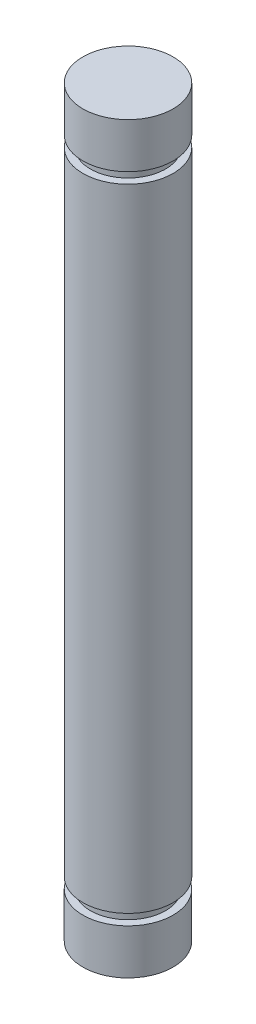
ISO-10303-21;
HEADER;
FILE_DESCRIPTION(('STEP AP214'),'2;1');
FILE_NAME('part.step','',(''),(''),'','','');
FILE_SCHEMA(('AUTOMOTIVE_DESIGN { 1 0 10303 214 1 1 1 1 }'));
ENDSEC;
DATA;
#1=APPLICATION_CONTEXT('core data for automotive mechanical design processes');
#2=APPLICATION_PROTOCOL_DEFINITION('international standard','automotive_design',2000,#1);
#3=PRODUCT_CONTEXT('',#1,'mechanical');
#4=PRODUCT('Part','Part','',(#3));
#5=PRODUCT_RELATED_PRODUCT_CATEGORY('part','',(#4));
#6=PRODUCT_DEFINITION_FORMATION('','',#4);
#7=PRODUCT_DEFINITION_CONTEXT('part definition',#1,'design');
#8=PRODUCT_DEFINITION('design','',#6,#7);
#9=PRODUCT_DEFINITION_SHAPE('','',#8);
#10=(LENGTH_UNIT() NAMED_UNIT(*) SI_UNIT(.MILLI.,.METRE.));
#11=(NAMED_UNIT(*) PLANE_ANGLE_UNIT() SI_UNIT($,.RADIAN.));
#12=(NAMED_UNIT(*) SI_UNIT($,.STERADIAN.) SOLID_ANGLE_UNIT());
#13=UNCERTAINTY_MEASURE_WITH_UNIT(LENGTH_MEASURE(1.E-05),#10,'distance_accuracy_value','');
#14=(GEOMETRIC_REPRESENTATION_CONTEXT(3) GLOBAL_UNCERTAINTY_ASSIGNED_CONTEXT((#13)) GLOBAL_UNIT_ASSIGNED_CONTEXT((#10,
#11,#12)) REPRESENTATION_CONTEXT('',''));
#15=CARTESIAN_POINT('',(0.,0.,0.));
#16=DIRECTION('',(0.,0.,1.));
#17=DIRECTION('',(1.,0.,0.));
#18=AXIS2_PLACEMENT_3D('',#15,#16,#17);
#19=CARTESIAN_POINT('',(0.,44.45,0.));
#20=DIRECTION('',(0.,-1.,0.));
#21=DIRECTION('',(0.,0.,-1.));
#22=AXIS2_PLACEMENT_3D('',#19,#20,#21);
#23=CYLINDRICAL_SURFACE('',#22,3.175);
#24=CARTESIAN_POINT('',(0.,44.45,0.));
#25=DIRECTION('',(0.,1.,0.));
#26=DIRECTION('',(0.,0.,1.));
#27=AXIS2_PLACEMENT_3D('',#24,#25,#26);
#28=CIRCLE('',#27,3.175);
#29=CARTESIAN_POINT('',(0.,44.45,3.175));
#30=VERTEX_POINT('',#29);
#31=EDGE_CURVE('E53',#30,#30,#28,.T.);
#32=ORIENTED_EDGE('',*,*,#31,.F.);
#33=EDGE_LOOP('',(#32));
#34=FACE_BOUND('',#33,.T.);
#35=CARTESIAN_POINT('',(0.,0.,0.));
#36=DIRECTION('',(0.,1.,0.));
#37=DIRECTION('',(0.,0.,1.));
#38=AXIS2_PLACEMENT_3D('',#35,#36,#37);
#39=CIRCLE('',#38,3.175);
#40=CARTESIAN_POINT('',(0.,0.,3.175));
#41=VERTEX_POINT('',#40);
#42=EDGE_CURVE('E42',#41,#41,#39,.T.);
#43=ORIENTED_EDGE('',*,*,#42,.T.);
#44=EDGE_LOOP('',(#43));
#45=FACE_BOUND('',#44,.T.);
#46=ADVANCED_FACE('F39',(#34,#45),#23,.T.);
#47=CARTESIAN_POINT('',(0.,44.45,0.));
#48=DIRECTION('',(0.,1.,0.));
#49=DIRECTION('',(0.,0.,1.));
#50=AXIS2_PLACEMENT_3D('',#47,#48,#49);
#51=PLANE('',#50);
#52=CARTESIAN_POINT('',(0.,44.45,0.));
#53=DIRECTION('',(0.,1.,0.));
#54=DIRECTION('',(0.,0.,1.));
#55=AXIS2_PLACEMENT_3D('',#52,#53,#54);
#56=CIRCLE('',#55,2.6416);
#57=CARTESIAN_POINT('',(0.,44.45,-2.6416));
#58=VERTEX_POINT('',#57);
#59=EDGE_CURVE('E47',#58,#58,#56,.T.);
#60=ORIENTED_EDGE('',*,*,#59,.F.);
#61=EDGE_LOOP('',(#60));
#62=FACE_BOUND('',#61,.T.);
#63=ORIENTED_EDGE('',*,*,#31,.T.);
#64=EDGE_LOOP('',(#63));
#65=FACE_BOUND('',#64,.T.);
#66=ADVANCED_FACE('F82',(#62,#65),#51,.T.);
#67=CARTESIAN_POINT('',(0.,0.,0.));
#68=DIRECTION('',(0.,1.,0.));
#69=DIRECTION('',(0.,0.,1.));
#70=AXIS2_PLACEMENT_3D('',#67,#68,#69);
#71=PLANE('',#70);
#72=CARTESIAN_POINT('',(0.,0.,0.));
#73=DIRECTION('',(0.,-1.,0.));
#74=DIRECTION('',(0.,0.,-1.));
#75=AXIS2_PLACEMENT_3D('',#72,#73,#74);
#76=CIRCLE('',#75,2.6416);
#77=CARTESIAN_POINT('',(0.,0.,2.6416));
#78=VERTEX_POINT('',#77);
#79=EDGE_CURVE('E10',#78,#78,#76,.T.);
#80=ORIENTED_EDGE('',*,*,#79,.F.);
#81=EDGE_LOOP('',(#80));
#82=FACE_BOUND('',#81,.T.);
#83=ORIENTED_EDGE('',*,*,#42,.F.);
#84=EDGE_LOOP('',(#83));
#85=FACE_BOUND('',#84,.T.);
#86=ADVANCED_FACE('F79',(#82,#85),#71,.F.);
#87=CARTESIAN_POINT('',(0.,45.212,0.));
#88=DIRECTION('',(0.,-1.,0.));
#89=DIRECTION('',(0.,0.,-1.));
#90=AXIS2_PLACEMENT_3D('',#87,#88,#89);
#91=CYLINDRICAL_SURFACE('',#90,2.6416);
#92=CARTESIAN_POINT('',(0.,45.212,0.));
#93=DIRECTION('',(0.,1.,0.));
#94=DIRECTION('',(0.,0.,1.));
#95=AXIS2_PLACEMENT_3D('',#92,#93,#94);
#96=CIRCLE('',#95,2.6416);
#97=CARTESIAN_POINT('',(0.,45.212,-2.6416));
#98=VERTEX_POINT('',#97);
#99=EDGE_CURVE('E63',#98,#98,#96,.T.);
#100=CARTESIAN_POINT('',(0.,45.212,-2.6416));
#101=CARTESIAN_POINT('',(0.,45.2040625,-2.6416));
#102=CARTESIAN_POINT('',(0.,45.196125,-2.6416));
#103=CARTESIAN_POINT('',(0.,45.18025,-2.6416));
#104=CARTESIAN_POINT('',(0.,45.1723125,-2.6416));
#105=CARTESIAN_POINT('',(0.,45.1564375,-2.6416));
#106=CARTESIAN_POINT('',(0.,45.1485,-2.6416));
#107=CARTESIAN_POINT('',(0.,45.132625,-2.6416));
#108=CARTESIAN_POINT('',(0.,45.1246875,-2.6416));
#109=CARTESIAN_POINT('',(0.,45.1088125,-2.6416));
#110=CARTESIAN_POINT('',(0.,45.100875,-2.6416));
#111=CARTESIAN_POINT('',(0.,45.085,-2.6416));
#112=CARTESIAN_POINT('',(0.,45.0770625,-2.6416));
#113=CARTESIAN_POINT('',(0.,45.0611875,-2.6416));
#114=CARTESIAN_POINT('',(0.,45.05325,-2.6416));
#115=CARTESIAN_POINT('',(0.,45.037375,-2.6416));
#116=CARTESIAN_POINT('',(0.,45.0294375,-2.6416));
#117=CARTESIAN_POINT('',(0.,45.0135625,-2.6416));
#118=CARTESIAN_POINT('',(0.,45.005625,-2.6416));
#119=CARTESIAN_POINT('',(0.,44.98975,-2.6416));
#120=CARTESIAN_POINT('',(0.,44.9818125,-2.6416));
#121=CARTESIAN_POINT('',(0.,44.9659375,-2.6416));
#122=CARTESIAN_POINT('',(0.,44.958,-2.6416));
#123=CARTESIAN_POINT('',(0.,44.942125,-2.6416));
#124=CARTESIAN_POINT('',(0.,44.9341875,-2.6416));
#125=CARTESIAN_POINT('',(0.,44.9183125,-2.6416));
#126=CARTESIAN_POINT('',(0.,44.910375,-2.6416));
#127=CARTESIAN_POINT('',(0.,44.8945,-2.6416));
#128=CARTESIAN_POINT('',(0.,44.8865625,-2.6416));
#129=CARTESIAN_POINT('',(0.,44.8706875,-2.6416));
#130=CARTESIAN_POINT('',(0.,44.86275,-2.6416));
#131=CARTESIAN_POINT('',(0.,44.846875,-2.6416));
#132=CARTESIAN_POINT('',(0.,44.8389375,-2.6416));
#133=CARTESIAN_POINT('',(0.,44.8230625,-2.6416));
#134=CARTESIAN_POINT('',(0.,44.815125,-2.6416));
#135=CARTESIAN_POINT('',(0.,44.79925,-2.6416));
#136=CARTESIAN_POINT('',(0.,44.7913125,-2.6416));
#137=CARTESIAN_POINT('',(0.,44.7754375,-2.6416));
#138=CARTESIAN_POINT('',(0.,44.7675,-2.6416));
#139=CARTESIAN_POINT('',(0.,44.751625,-2.6416));
#140=CARTESIAN_POINT('',(0.,44.7436875,-2.6416));
#141=CARTESIAN_POINT('',(0.,44.7278125,-2.6416));
#142=CARTESIAN_POINT('',(0.,44.719875,-2.6416));
#143=CARTESIAN_POINT('',(0.,44.704,-2.6416));
#144=CARTESIAN_POINT('',(0.,44.6960625,-2.6416));
#145=CARTESIAN_POINT('',(0.,44.6801875,-2.6416));
#146=CARTESIAN_POINT('',(0.,44.67225,-2.6416));
#147=CARTESIAN_POINT('',(0.,44.656375,-2.6416));
#148=CARTESIAN_POINT('',(0.,44.6484375,-2.6416));
#149=CARTESIAN_POINT('',(0.,44.6325625,-2.6416));
#150=CARTESIAN_POINT('',(0.,44.624625,-2.6416));
#151=CARTESIAN_POINT('',(0.,44.60875,-2.6416));
#152=CARTESIAN_POINT('',(0.,44.6008125,-2.6416));
#153=CARTESIAN_POINT('',(0.,44.5849375,-2.6416));
#154=CARTESIAN_POINT('',(0.,44.577,-2.6416));
#155=CARTESIAN_POINT('',(0.,44.561125,-2.6416));
#156=CARTESIAN_POINT('',(0.,44.5531875,-2.6416));
#157=CARTESIAN_POINT('',(0.,44.5373125,-2.6416));
#158=CARTESIAN_POINT('',(0.,44.529375,-2.6416));
#159=CARTESIAN_POINT('',(0.,44.5135,-2.6416));
#160=CARTESIAN_POINT('',(0.,44.5055625,-2.6416));
#161=CARTESIAN_POINT('',(0.,44.4896875,-2.6416));
#162=CARTESIAN_POINT('',(0.,44.48175,-2.6416));
#163=CARTESIAN_POINT('',(0.,44.465875,-2.6416));
#164=CARTESIAN_POINT('',(0.,44.4579375,-2.6416));
#165=CARTESIAN_POINT('',(0.,44.45,-2.6416));
#166=B_SPLINE_CURVE_WITH_KNOTS('',3,(#100,#101,#102,#103,#104,#105,#106,#107,#108,#109,#110,
#111,#112,#113,#114,#115,#116,#117,#118,#119,#120,#121,#122,#123,#124,#125,#126,#127,#128,#129,
#130,#131,#132,#133,#134,#135,#136,#137,#138,#139,#140,#141,#142,#143,#144,#145,#146,#147,#148,
#149,#150,#151,#152,#153,#154,#155,#156,#157,#158,#159,#160,#161,#162,#163,#164,#165),
.UNSPECIFIED.,.F.,.F.,(4,2,2,2,2,2,2,2,2,2,2,2,2,2,2,2,2,2,2,2,2,2,2,2,2,2,2,2,2,2,2,2,4),(0.,
0.0238124999999978,0.0476249999999956,0.0714374999999934,0.0952499999999981,0.119062499999996,
0.142874999999994,0.166687499999998,0.190499999999996,0.214312499999994,0.238124999999999,
0.261937499999997,0.285749999999994,0.309562499999999,0.333374999999997,0.357187499999995,
0.380999999999992,0.404812499999997,0.428624999999995,0.452437499999993,0.476249999999998,
0.500062499999995,0.523874999999993,0.547687499999998,0.571499999999996,0.595312499999993,
0.619124999999998,0.642937499999996,0.666749999999994,0.690562499999998,0.714374999999996,
0.738187499999994,0.761999999999992),.UNSPECIFIED.);
#167=EDGE_CURVE('BSEAM81',#98,#58,#166,.T.);
#168=ORIENTED_EDGE('',*,*,#99,.F.);
#169=ORIENTED_EDGE('',*,*,#59,.T.);
#170=ORIENTED_EDGE('',*,*,#167,.T.);
#171=ORIENTED_EDGE('',*,*,#167,.F.);
#172=EDGE_LOOP('',(#168,#170,#169,#171));
#173=FACE_BOUND('',#172,.T.);
#174=ADVANCED_FACE('F81',(#173),#91,.T.);
#175=CARTESIAN_POINT('',(0.,48.387,0.));
#176=DIRECTION('',(0.,-1.,0.));
#177=DIRECTION('',(0.,0.,-1.));
#178=AXIS2_PLACEMENT_3D('',#175,#176,#177);
#179=CYLINDRICAL_SURFACE('',#178,3.175);
#180=CARTESIAN_POINT('',(0.,48.387,0.));
#181=DIRECTION('',(0.,1.,0.));
#182=DIRECTION('',(0.,0.,1.));
#183=AXIS2_PLACEMENT_3D('',#180,#181,#182);
#184=CIRCLE('',#183,3.175);
#185=CARTESIAN_POINT('',(0.,48.387,3.175));
#186=VERTEX_POINT('',#185);
#187=EDGE_CURVE('E59',#186,#186,#184,.T.);
#188=ORIENTED_EDGE('',*,*,#187,.F.);
#189=EDGE_LOOP('',(#188));
#190=FACE_BOUND('',#189,.T.);
#191=CARTESIAN_POINT('',(0.,45.212,0.));
#192=DIRECTION('',(0.,1.,0.));
#193=DIRECTION('',(0.,0.,1.));
#194=AXIS2_PLACEMENT_3D('',#191,#192,#193);
#195=CIRCLE('',#194,3.175);
#196=CARTESIAN_POINT('',(0.,45.212,3.175));
#197=VERTEX_POINT('',#196);
#198=EDGE_CURVE('E64',#197,#197,#195,.T.);
#199=ORIENTED_EDGE('',*,*,#198,.T.);
#200=EDGE_LOOP('',(#199));
#201=FACE_BOUND('',#200,.T.);
#202=ADVANCED_FACE('F88',(#190,#201),#179,.T.);
#203=CARTESIAN_POINT('',(0.,48.387,0.));
#204=DIRECTION('',(0.,1.,0.));
#205=DIRECTION('',(0.,0.,1.));
#206=AXIS2_PLACEMENT_3D('',#203,#204,#205);
#207=PLANE('',#206);
#208=ORIENTED_EDGE('',*,*,#187,.T.);
#209=EDGE_LOOP('',(#208));
#210=FACE_BOUND('',#209,.T.);
#211=ADVANCED_FACE('F117',(#210),#207,.T.);
#212=CARTESIAN_POINT('',(0.,45.212,0.));
#213=DIRECTION('',(0.,1.,0.));
#214=DIRECTION('',(0.,0.,1.));
#215=AXIS2_PLACEMENT_3D('',#212,#213,#214);
#216=PLANE('',#215);
#217=ORIENTED_EDGE('',*,*,#99,.T.);
#218=EDGE_LOOP('',(#217));
#219=FACE_BOUND('',#218,.T.);
#220=ORIENTED_EDGE('',*,*,#198,.F.);
#221=EDGE_LOOP('',(#220));
#222=FACE_BOUND('',#221,.T.);
#223=ADVANCED_FACE('F127',(#219,#222),#216,.F.);
#224=CARTESIAN_POINT('',(0.,-0.762,0.));
#225=DIRECTION('',(0.,1.,0.));
#226=DIRECTION('',(0.,0.,1.));
#227=AXIS2_PLACEMENT_3D('',#224,#225,#226);
#228=CYLINDRICAL_SURFACE('',#227,2.6416);
#229=CARTESIAN_POINT('',(0.,-0.762,0.));
#230=DIRECTION('',(0.,-1.,0.));
#231=DIRECTION('',(0.,0.,-1.));
#232=AXIS2_PLACEMENT_3D('',#229,#230,#231);
#233=CIRCLE('',#232,2.6416);
#234=CARTESIAN_POINT('',(0.,-0.762,2.6416));
#235=VERTEX_POINT('',#234);
#236=EDGE_CURVE('E57',#235,#235,#233,.T.);
#237=CARTESIAN_POINT('',(0.,-0.762,2.6416));
#238=CARTESIAN_POINT('',(0.,-0.7540625,2.6416));
#239=CARTESIAN_POINT('',(0.,-0.746125,2.6416));
#240=CARTESIAN_POINT('',(0.,-0.73025,2.6416));
#241=CARTESIAN_POINT('',(0.,-0.7223125,2.6416));
#242=CARTESIAN_POINT('',(0.,-0.7064375,2.6416));
#243=CARTESIAN_POINT('',(0.,-0.6985,2.6416));
#244=CARTESIAN_POINT('',(0.,-0.682625,2.6416));
#245=CARTESIAN_POINT('',(0.,-0.6746875,2.6416));
#246=CARTESIAN_POINT('',(0.,-0.6588125,2.6416));
#247=CARTESIAN_POINT('',(0.,-0.650875,2.6416));
#248=CARTESIAN_POINT('',(0.,-0.635,2.6416));
#249=CARTESIAN_POINT('',(0.,-0.6270625,2.6416));
#250=CARTESIAN_POINT('',(0.,-0.6111875,2.6416));
#251=CARTESIAN_POINT('',(0.,-0.60325,2.6416));
#252=CARTESIAN_POINT('',(0.,-0.587375,2.6416));
#253=CARTESIAN_POINT('',(0.,-0.5794375,2.6416));
#254=CARTESIAN_POINT('',(0.,-0.5635625,2.6416));
#255=CARTESIAN_POINT('',(0.,-0.555625,2.6416));
#256=CARTESIAN_POINT('',(0.,-0.53975,2.6416));
#257=CARTESIAN_POINT('',(0.,-0.5318125,2.6416));
#258=CARTESIAN_POINT('',(0.,-0.5159375,2.6416));
#259=CARTESIAN_POINT('',(0.,-0.508,2.6416));
#260=CARTESIAN_POINT('',(0.,-0.492125,2.6416));
#261=CARTESIAN_POINT('',(0.,-0.4841875,2.6416));
#262=CARTESIAN_POINT('',(0.,-0.4683125,2.6416));
#263=CARTESIAN_POINT('',(0.,-0.460375,2.6416));
#264=CARTESIAN_POINT('',(0.,-0.4445,2.6416));
#265=CARTESIAN_POINT('',(0.,-0.4365625,2.6416));
#266=CARTESIAN_POINT('',(0.,-0.4206875,2.6416));
#267=CARTESIAN_POINT('',(0.,-0.41275,2.6416));
#268=CARTESIAN_POINT('',(0.,-0.396875,2.6416));
#269=CARTESIAN_POINT('',(0.,-0.3889375,2.6416));
#270=CARTESIAN_POINT('',(0.,-0.3730625,2.6416));
#271=CARTESIAN_POINT('',(0.,-0.365125,2.6416));
#272=CARTESIAN_POINT('',(0.,-0.34925,2.6416));
#273=CARTESIAN_POINT('',(0.,-0.3413125,2.6416));
#274=CARTESIAN_POINT('',(0.,-0.3254375,2.6416));
#275=CARTESIAN_POINT('',(0.,-0.3175,2.6416));
#276=CARTESIAN_POINT('',(0.,-0.301625,2.6416));
#277=CARTESIAN_POINT('',(0.,-0.2936875,2.6416));
#278=CARTESIAN_POINT('',(0.,-0.2778125,2.6416));
#279=CARTESIAN_POINT('',(0.,-0.269875,2.6416));
#280=CARTESIAN_POINT('',(0.,-0.254,2.6416));
#281=CARTESIAN_POINT('',(0.,-0.2460625,2.6416));
#282=CARTESIAN_POINT('',(0.,-0.2301875,2.6416));
#283=CARTESIAN_POINT('',(0.,-0.22225,2.6416));
#284=CARTESIAN_POINT('',(0.,-0.206375,2.6416));
#285=CARTESIAN_POINT('',(0.,-0.1984375,2.6416));
#286=CARTESIAN_POINT('',(0.,-0.1825625,2.6416));
#287=CARTESIAN_POINT('',(0.,-0.174625,2.6416));
#288=CARTESIAN_POINT('',(0.,-0.15875,2.6416));
#289=CARTESIAN_POINT('',(0.,-0.1508125,2.6416));
#290=CARTESIAN_POINT('',(0.,-0.1349375,2.6416));
#291=CARTESIAN_POINT('',(0.,-0.127,2.6416));
#292=CARTESIAN_POINT('',(0.,-0.111125,2.6416));
#293=CARTESIAN_POINT('',(0.,-0.1031875,2.6416));
#294=CARTESIAN_POINT('',(0.,-0.0873125,2.6416));
#295=CARTESIAN_POINT('',(0.,-0.079375,2.6416));
#296=CARTESIAN_POINT('',(0.,-0.0635,2.6416));
#297=CARTESIAN_POINT('',(0.,-0.0555625,2.6416));
#298=CARTESIAN_POINT('',(0.,-0.0396875,2.6416));
#299=CARTESIAN_POINT('',(0.,-0.03175,2.6416));
#300=CARTESIAN_POINT('',(0.,-0.015875,2.6416));
#301=CARTESIAN_POINT('',(0.,-0.00793749999999999,2.6416));
#302=CARTESIAN_POINT('',(0.,0.,2.6416));
#303=B_SPLINE_CURVE_WITH_KNOTS('',3,(#237,#238,#239,#240,#241,#242,#243,#244,#245,#246,#247,
#248,#249,#250,#251,#252,#253,#254,#255,#256,#257,#258,#259,#260,#261,#262,#263,#264,#265,#266,
#267,#268,#269,#270,#271,#272,#273,#274,#275,#276,#277,#278,#279,#280,#281,#282,#283,#284,#285,
#286,#287,#288,#289,#290,#291,#292,#293,#294,#295,#296,#297,#298,#299,#300,#301,#302),
.UNSPECIFIED.,.F.,.F.,(4,2,2,2,2,2,2,2,2,2,2,2,2,2,2,2,2,2,2,2,2,2,2,2,2,2,2,2,2,2,2,2,4),(0.,
0.0238125,0.0476249999999999,0.0714374999999999,0.09525,0.1190625,0.142875,0.1666875,0.1905,
0.2143125,0.238125,0.2619375,0.28575,0.3095625,0.333375,0.3571875,0.381,0.4048125,0.428625,
0.4524375,0.47625,0.5000625,0.523875,0.5476875,0.5715,0.5953125,0.619125,0.6429375,0.66675,
0.6905625,0.714375,0.7381875,0.762),.UNSPECIFIED.);
#304=EDGE_CURVE('BSEAM136',#235,#78,#303,.T.);
#305=ORIENTED_EDGE('',*,*,#236,.F.);
#306=ORIENTED_EDGE('',*,*,#79,.T.);
#307=ORIENTED_EDGE('',*,*,#304,.T.);
#308=ORIENTED_EDGE('',*,*,#304,.F.);
#309=EDGE_LOOP('',(#305,#307,#306,#308));
#310=FACE_BOUND('',#309,.T.);
#311=ADVANCED_FACE('F136',(#310),#228,.T.);
#312=CARTESIAN_POINT('',(0.,-3.937,0.));
#313=DIRECTION('',(0.,1.,0.));
#314=DIRECTION('',(0.,0.,1.));
#315=AXIS2_PLACEMENT_3D('',#312,#313,#314);
#316=CYLINDRICAL_SURFACE('',#315,3.175);
#317=CARTESIAN_POINT('',(0.,-3.937,0.));
#318=DIRECTION('',(0.,-1.,0.));
#319=DIRECTION('',(0.,0.,-1.));
#320=AXIS2_PLACEMENT_3D('',#317,#318,#319);
#321=CIRCLE('',#320,3.175);
#322=CARTESIAN_POINT('',(0.,-3.937,-3.175));
#323=VERTEX_POINT('',#322);
#324=EDGE_CURVE('E192',#323,#323,#321,.T.);
#325=ORIENTED_EDGE('',*,*,#324,.F.);
#326=EDGE_LOOP('',(#325));
#327=FACE_BOUND('',#326,.T.);
#328=CARTESIAN_POINT('',(0.,-0.762,0.));
#329=DIRECTION('',(0.,-1.,0.));
#330=DIRECTION('',(0.,0.,-1.));
#331=AXIS2_PLACEMENT_3D('',#328,#329,#330);
#332=CIRCLE('',#331,3.175);
#333=CARTESIAN_POINT('',(0.,-0.762,-3.175));
#334=VERTEX_POINT('',#333);
#335=EDGE_CURVE('E189',#334,#334,#332,.T.);
#336=ORIENTED_EDGE('',*,*,#335,.T.);
#337=EDGE_LOOP('',(#336));
#338=FACE_BOUND('',#337,.T.);
#339=ADVANCED_FACE('F150',(#327,#338),#316,.T.);
#340=CARTESIAN_POINT('',(0.,-3.937,0.));
#341=DIRECTION('',(0.,-1.,0.));
#342=DIRECTION('',(0.,0.,-1.));
#343=AXIS2_PLACEMENT_3D('',#340,#341,#342);
#344=PLANE('',#343);
#345=ORIENTED_EDGE('',*,*,#324,.T.);
#346=EDGE_LOOP('',(#345));
#347=FACE_BOUND('',#346,.T.);
#348=ADVANCED_FACE('F160',(#347),#344,.T.);
#349=CARTESIAN_POINT('',(0.,-0.762,0.));
#350=DIRECTION('',(0.,-1.,0.));
#351=DIRECTION('',(0.,0.,-1.));
#352=AXIS2_PLACEMENT_3D('',#349,#350,#351);
#353=PLANE('',#352);
#354=ORIENTED_EDGE('',*,*,#236,.T.);
#355=EDGE_LOOP('',(#354));
#356=FACE_BOUND('',#355,.T.);
#357=ORIENTED_EDGE('',*,*,#335,.F.);
#358=EDGE_LOOP('',(#357));
#359=FACE_BOUND('',#358,.T.);
#360=ADVANCED_FACE('F170',(#356,#359),#353,.F.);
#361=CLOSED_SHELL('',(#46,#66,#86,#174,#202,#211,#223,#311,#339,#348,#360));
#362=MANIFOLD_SOLID_BREP('B2',#361);
#363=ADVANCED_BREP_SHAPE_REPRESENTATION('',(#18,#362),#14);
#364=SHAPE_DEFINITION_REPRESENTATION(#9,#363);
ENDSEC;
END-ISO-10303-21;
